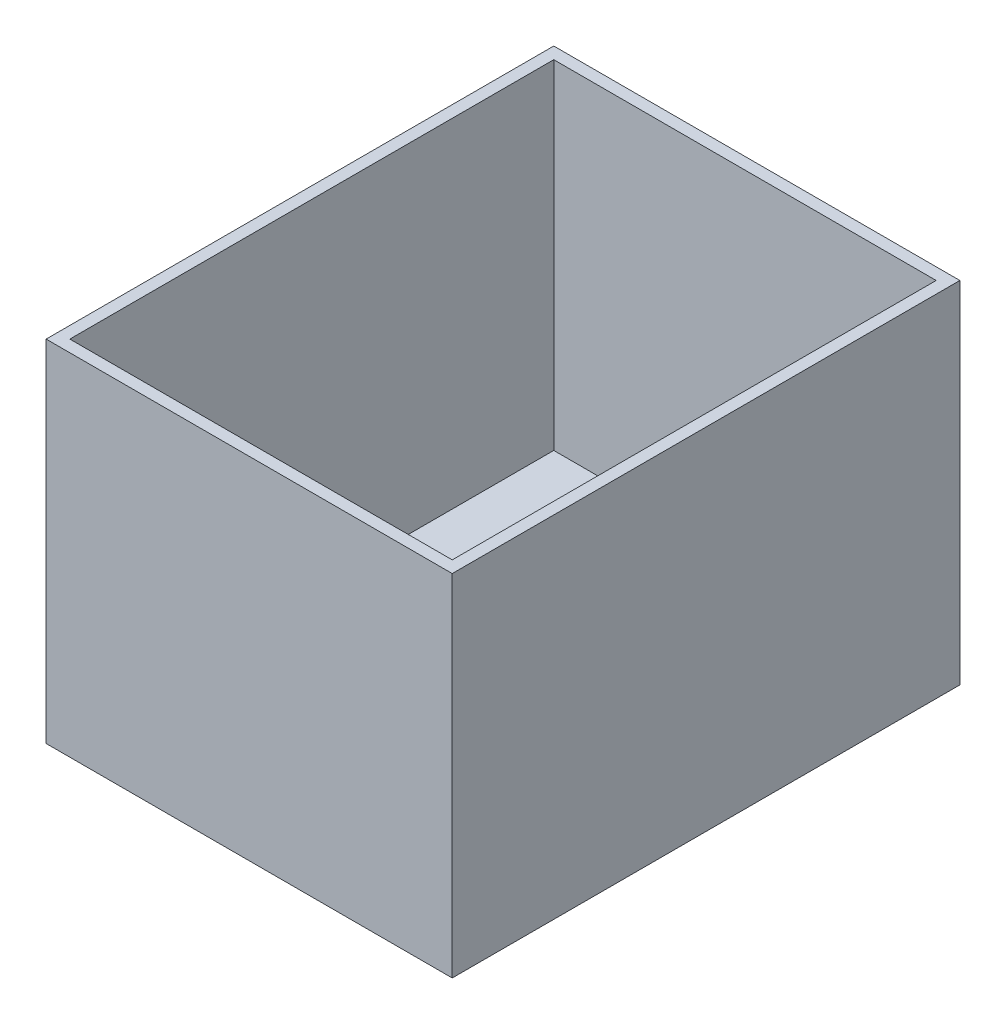
ISO-10303-21;
HEADER;
FILE_DESCRIPTION(('STEP AP214'),'2;1');
FILE_NAME('part.step','',(''),(''),'','','');
FILE_SCHEMA(('AUTOMOTIVE_DESIGN { 1 0 10303 214 1 1 1 1 }'));
ENDSEC;
DATA;
#1=APPLICATION_CONTEXT('core data for automotive mechanical design processes');
#2=APPLICATION_PROTOCOL_DEFINITION('international standard','automotive_design',2000,#1);
#3=PRODUCT_CONTEXT('',#1,'mechanical');
#4=PRODUCT('Part','Part','',(#3));
#5=PRODUCT_RELATED_PRODUCT_CATEGORY('part','',(#4));
#6=PRODUCT_DEFINITION_FORMATION('','',#4);
#7=PRODUCT_DEFINITION_CONTEXT('part definition',#1,'design');
#8=PRODUCT_DEFINITION('design','',#6,#7);
#9=PRODUCT_DEFINITION_SHAPE('','',#8);
#10=(LENGTH_UNIT() NAMED_UNIT(*) SI_UNIT(.MILLI.,.METRE.));
#11=(NAMED_UNIT(*) PLANE_ANGLE_UNIT() SI_UNIT($,.RADIAN.));
#12=(NAMED_UNIT(*) SI_UNIT($,.STERADIAN.) SOLID_ANGLE_UNIT());
#13=UNCERTAINTY_MEASURE_WITH_UNIT(LENGTH_MEASURE(1.E-05),#10,'distance_accuracy_value','');
#14=(GEOMETRIC_REPRESENTATION_CONTEXT(3) GLOBAL_UNCERTAINTY_ASSIGNED_CONTEXT((#13)) GLOBAL_UNIT_ASSIGNED_CONTEXT((#10,
#11,#12)) REPRESENTATION_CONTEXT('',''));
#15=CARTESIAN_POINT('',(0.,0.,0.));
#16=DIRECTION('',(0.,0.,1.));
#17=DIRECTION('',(1.,0.,0.));
#18=AXIS2_PLACEMENT_3D('',#15,#16,#17);
#19=CARTESIAN_POINT('',(0.,3.5,0.));
#20=DIRECTION('',(-1.,0.,0.));
#21=DIRECTION('',(0.,0.,1.));
#22=AXIS2_PLACEMENT_3D('',#19,#20,#21);
#23=PLANE('',#22);
#24=DIRECTION('',(0.,0.,-1.));
#25=VECTOR('',#24,1.);
#26=CARTESIAN_POINT('',(0.,0.,0.));
#27=LINE('',#26,#25);
#28=CARTESIAN_POINT('',(0.,0.,0.));
#29=VERTEX_POINT('',#28);
#30=CARTESIAN_POINT('',(0.,0.,-150.));
#31=VERTEX_POINT('',#30);
#32=EDGE_CURVE('E173',#29,#31,#27,.T.);
#33=ORIENTED_EDGE('',*,*,#32,.T.);
#34=DIRECTION('',(0.,-1.,0.));
#35=VECTOR('',#34,1.);
#36=CARTESIAN_POINT('',(0.,3.5,-150.));
#37=LINE('',#36,#35);
#38=CARTESIAN_POINT('',(0.,103.5,-150.));
#39=VERTEX_POINT('',#38);
#40=EDGE_CURVE('E11',#39,#31,#37,.T.);
#41=ORIENTED_EDGE('',*,*,#40,.F.);
#42=DIRECTION('',(0.,0.,-1.));
#43=VECTOR('',#42,1.);
#44=CARTESIAN_POINT('',(0.,103.5,0.));
#45=LINE('',#44,#43);
#46=CARTESIAN_POINT('',(0.,103.5,0.));
#47=VERTEX_POINT('',#46);
#48=EDGE_CURVE('E161',#47,#39,#45,.T.);
#49=ORIENTED_EDGE('',*,*,#48,.F.);
#50=DIRECTION('',(0.,-1.,0.));
#51=VECTOR('',#50,1.);
#52=CARTESIAN_POINT('',(0.,3.5,0.));
#53=LINE('',#52,#51);
#54=EDGE_CURVE('E186',#47,#29,#53,.T.);
#55=ORIENTED_EDGE('',*,*,#54,.T.);
#56=EDGE_LOOP('',(#33,#41,#49,#55));
#57=FACE_BOUND('',#56,.T.);
#58=ADVANCED_FACE('F45',(#57),#23,.F.);
#59=CARTESIAN_POINT('',(0.,3.5,-150.));
#60=DIRECTION('',(0.,0.,1.));
#61=DIRECTION('',(1.,0.,0.));
#62=AXIS2_PLACEMENT_3D('',#59,#60,#61);
#63=PLANE('',#62);
#64=DIRECTION('',(-1.,0.,0.));
#65=VECTOR('',#64,1.);
#66=CARTESIAN_POINT('',(0.,0.,-150.));
#67=LINE('',#66,#65);
#68=CARTESIAN_POINT('',(-120.,0.,-150.));
#69=VERTEX_POINT('',#68);
#70=EDGE_CURVE('E177',#31,#69,#67,.T.);
#71=ORIENTED_EDGE('',*,*,#70,.T.);
#72=DIRECTION('',(0.,-1.,0.));
#73=VECTOR('',#72,1.);
#74=CARTESIAN_POINT('',(-120.,3.5,-150.));
#75=LINE('',#74,#73);
#76=CARTESIAN_POINT('',(-120.,103.5,-150.));
#77=VERTEX_POINT('',#76);
#78=EDGE_CURVE('E53',#77,#69,#75,.T.);
#79=ORIENTED_EDGE('',*,*,#78,.F.);
#80=DIRECTION('',(-1.,0.,0.));
#81=VECTOR('',#80,1.);
#82=CARTESIAN_POINT('',(0.,103.5,-150.));
#83=LINE('',#82,#81);
#84=EDGE_CURVE('E165',#39,#77,#83,.T.);
#85=ORIENTED_EDGE('',*,*,#84,.F.);
#86=ORIENTED_EDGE('',*,*,#40,.T.);
#87=EDGE_LOOP('',(#71,#79,#85,#86));
#88=FACE_BOUND('',#87,.T.);
#89=ADVANCED_FACE('F211',(#88),#63,.F.);
#90=CARTESIAN_POINT('',(-120.,3.5,0.));
#91=DIRECTION('',(1.,0.,0.));
#92=DIRECTION('',(0.,0.,-1.));
#93=AXIS2_PLACEMENT_3D('',#90,#91,#92);
#94=PLANE('',#93);
#95=DIRECTION('',(0.,0.,1.));
#96=VECTOR('',#95,1.);
#97=CARTESIAN_POINT('',(-120.,0.,0.));
#98=LINE('',#97,#96);
#99=CARTESIAN_POINT('',(-120.,0.,0.));
#100=VERTEX_POINT('',#99);
#101=EDGE_CURVE('E180',#69,#100,#98,.T.);
#102=ORIENTED_EDGE('',*,*,#101,.T.);
#103=DIRECTION('',(0.,-1.,0.));
#104=VECTOR('',#103,1.);
#105=CARTESIAN_POINT('',(-120.,3.5,0.));
#106=LINE('',#105,#104);
#107=CARTESIAN_POINT('',(-120.,103.5,0.));
#108=VERTEX_POINT('',#107);
#109=EDGE_CURVE('E190',#108,#100,#106,.T.);
#110=ORIENTED_EDGE('',*,*,#109,.F.);
#111=DIRECTION('',(0.,0.,1.));
#112=VECTOR('',#111,1.);
#113=CARTESIAN_POINT('',(-120.,103.5,-150.));
#114=LINE('',#113,#112);
#115=EDGE_CURVE('E169',#77,#108,#114,.T.);
#116=ORIENTED_EDGE('',*,*,#115,.F.);
#117=ORIENTED_EDGE('',*,*,#78,.T.);
#118=EDGE_LOOP('',(#102,#110,#116,#117));
#119=FACE_BOUND('',#118,.T.);
#120=ADVANCED_FACE('F198',(#119),#94,.F.);
#121=CARTESIAN_POINT('',(0.,3.5,0.));
#122=DIRECTION('',(0.,0.,-1.));
#123=DIRECTION('',(-1.,0.,0.));
#124=AXIS2_PLACEMENT_3D('',#121,#122,#123);
#125=PLANE('',#124);
#126=DIRECTION('',(1.,0.,0.));
#127=VECTOR('',#126,1.);
#128=CARTESIAN_POINT('',(0.,0.,0.));
#129=LINE('',#128,#127);
#130=EDGE_CURVE('E183',#100,#29,#129,.T.);
#131=ORIENTED_EDGE('',*,*,#130,.T.);
#132=ORIENTED_EDGE('',*,*,#54,.F.);
#133=DIRECTION('',(1.,0.,0.));
#134=VECTOR('',#133,1.);
#135=CARTESIAN_POINT('',(-120.,103.5,0.));
#136=LINE('',#135,#134);
#137=EDGE_CURVE('E126',#108,#47,#136,.T.);
#138=ORIENTED_EDGE('',*,*,#137,.F.);
#139=ORIENTED_EDGE('',*,*,#109,.T.);
#140=EDGE_LOOP('',(#131,#132,#138,#139));
#141=FACE_BOUND('',#140,.T.);
#142=ADVANCED_FACE('F206',(#141),#125,.F.);
#143=CARTESIAN_POINT('',(0.,0.,0.));
#144=DIRECTION('',(0.,1.,0.));
#145=DIRECTION('',(0.,0.,1.));
#146=AXIS2_PLACEMENT_3D('',#143,#144,#145);
#147=PLANE('',#146);
#148=ORIENTED_EDGE('',*,*,#32,.F.);
#149=ORIENTED_EDGE('',*,*,#130,.F.);
#150=ORIENTED_EDGE('',*,*,#101,.F.);
#151=ORIENTED_EDGE('',*,*,#70,.F.);
#152=EDGE_LOOP('',(#148,#149,#150,#151));
#153=FACE_BOUND('',#152,.T.);
#154=ADVANCED_FACE('F204',(#153),#147,.F.);
#155=CARTESIAN_POINT('',(0.,103.5,0.));
#156=DIRECTION('',(0.,1.,0.));
#157=DIRECTION('',(0.,0.,1.));
#158=AXIS2_PLACEMENT_3D('',#155,#156,#157);
#159=PLANE('',#158);
#160=ORIENTED_EDGE('',*,*,#137,.T.);
#161=ORIENTED_EDGE('',*,*,#48,.T.);
#162=ORIENTED_EDGE('',*,*,#84,.T.);
#163=ORIENTED_EDGE('',*,*,#115,.T.);
#164=EDGE_LOOP('',(#160,#161,#162,#163));
#165=FACE_BOUND('',#164,.T.);
#166=DIRECTION('',(-1.,0.,0.));
#167=VECTOR('',#166,1.);
#168=CARTESIAN_POINT('',(-3.5,103.5,-146.5));
#169=LINE('',#168,#167);
#170=CARTESIAN_POINT('',(-3.5,103.5,-146.5));
#171=VERTEX_POINT('',#170);
#172=CARTESIAN_POINT('',(-116.5,103.5,-146.5));
#173=VERTEX_POINT('',#172);
#174=EDGE_CURVE('E119',#171,#173,#169,.T.);
#175=ORIENTED_EDGE('',*,*,#174,.F.);
#176=DIRECTION('',(0.,0.,-1.));
#177=VECTOR('',#176,1.);
#178=CARTESIAN_POINT('',(-3.5,103.5,-3.5));
#179=LINE('',#178,#177);
#180=CARTESIAN_POINT('',(-3.5,103.5,-3.5));
#181=VERTEX_POINT('',#180);
#182=EDGE_CURVE('E109',#181,#171,#179,.T.);
#183=ORIENTED_EDGE('',*,*,#182,.F.);
#184=DIRECTION('',(1.,0.,0.));
#185=VECTOR('',#184,1.);
#186=CARTESIAN_POINT('',(-3.5,103.5,-3.5));
#187=LINE('',#186,#185);
#188=CARTESIAN_POINT('',(-116.5,103.5,-3.49999999999999));
#189=VERTEX_POINT('',#188);
#190=EDGE_CURVE('E136',#189,#181,#187,.T.);
#191=ORIENTED_EDGE('',*,*,#190,.F.);
#192=DIRECTION('',(0.,0.,1.));
#193=VECTOR('',#192,1.);
#194=CARTESIAN_POINT('',(-116.5,103.5,-3.49999999999999));
#195=LINE('',#194,#193);
#196=EDGE_CURVE('E132',#173,#189,#195,.T.);
#197=ORIENTED_EDGE('',*,*,#196,.F.);
#198=EDGE_LOOP('',(#175,#183,#191,#197));
#199=FACE_BOUND('',#198,.T.);
#200=ADVANCED_FACE('F130',(#165,#199),#159,.T.);
#201=CARTESIAN_POINT('',(-3.5,103.5,-3.5));
#202=DIRECTION('',(-1.,0.,0.));
#203=DIRECTION('',(0.,0.,1.));
#204=AXIS2_PLACEMENT_3D('',#201,#202,#203);
#205=PLANE('',#204);
#206=DIRECTION('',(0.,0.,-1.));
#207=VECTOR('',#206,1.);
#208=CARTESIAN_POINT('',(-3.5,3.5,-3.5));
#209=LINE('',#208,#207);
#210=CARTESIAN_POINT('',(-3.5,3.5,-3.5));
#211=VERTEX_POINT('',#210);
#212=CARTESIAN_POINT('',(-3.5,3.5,-146.5));
#213=VERTEX_POINT('',#212);
#214=EDGE_CURVE('E60',#211,#213,#209,.T.);
#215=ORIENTED_EDGE('',*,*,#214,.F.);
#216=DIRECTION('',(0.,-1.,0.));
#217=VECTOR('',#216,1.);
#218=CARTESIAN_POINT('',(-3.5,103.5,-3.5));
#219=LINE('',#218,#217);
#220=EDGE_CURVE('E114',#181,#211,#219,.T.);
#221=ORIENTED_EDGE('',*,*,#220,.F.);
#222=ORIENTED_EDGE('',*,*,#182,.T.);
#223=DIRECTION('',(0.,-1.,0.));
#224=VECTOR('',#223,1.);
#225=CARTESIAN_POINT('',(-3.5,103.5,-146.5));
#226=LINE('',#225,#224);
#227=EDGE_CURVE('E112',#171,#213,#226,.T.);
#228=ORIENTED_EDGE('',*,*,#227,.T.);
#229=EDGE_LOOP('',(#215,#221,#222,#228));
#230=FACE_BOUND('',#229,.T.);
#231=ADVANCED_FACE('F111',(#230),#205,.T.);
#232=CARTESIAN_POINT('',(-3.5,103.5,-146.5));
#233=DIRECTION('',(0.,0.,1.));
#234=DIRECTION('',(1.,0.,0.));
#235=AXIS2_PLACEMENT_3D('',#232,#233,#234);
#236=PLANE('',#235);
#237=DIRECTION('',(-1.,0.,0.));
#238=VECTOR('',#237,1.);
#239=CARTESIAN_POINT('',(-3.5,3.5,-146.5));
#240=LINE('',#239,#238);
#241=CARTESIAN_POINT('',(-116.5,3.5,-146.5));
#242=VERTEX_POINT('',#241);
#243=EDGE_CURVE('E64',#213,#242,#240,.T.);
#244=ORIENTED_EDGE('',*,*,#243,.F.);
#245=ORIENTED_EDGE('',*,*,#227,.F.);
#246=ORIENTED_EDGE('',*,*,#174,.T.);
#247=DIRECTION('',(0.,-1.,0.));
#248=VECTOR('',#247,1.);
#249=CARTESIAN_POINT('',(-116.5,103.5,-146.5));
#250=LINE('',#249,#248);
#251=EDGE_CURVE('E127',#173,#242,#250,.T.);
#252=ORIENTED_EDGE('',*,*,#251,.T.);
#253=EDGE_LOOP('',(#244,#245,#246,#252));
#254=FACE_BOUND('',#253,.T.);
#255=ADVANCED_FACE('F123',(#254),#236,.T.);
#256=CARTESIAN_POINT('',(-116.5,103.5,-3.49999999999999));
#257=DIRECTION('',(1.,0.,0.));
#258=DIRECTION('',(0.,0.,-1.));
#259=AXIS2_PLACEMENT_3D('',#256,#257,#258);
#260=PLANE('',#259);
#261=DIRECTION('',(0.,0.,1.));
#262=VECTOR('',#261,1.);
#263=CARTESIAN_POINT('',(-116.5,3.5,-3.49999999999999));
#264=LINE('',#263,#262);
#265=CARTESIAN_POINT('',(-116.5,3.5,-3.49999999999999));
#266=VERTEX_POINT('',#265);
#267=EDGE_CURVE('E145',#242,#266,#264,.T.);
#268=ORIENTED_EDGE('',*,*,#267,.F.);
#269=ORIENTED_EDGE('',*,*,#251,.F.);
#270=ORIENTED_EDGE('',*,*,#196,.T.);
#271=DIRECTION('',(0.,-1.,0.));
#272=VECTOR('',#271,1.);
#273=CARTESIAN_POINT('',(-116.5,103.5,-3.49999999999999));
#274=LINE('',#273,#272);
#275=EDGE_CURVE('E152',#189,#266,#274,.T.);
#276=ORIENTED_EDGE('',*,*,#275,.T.);
#277=EDGE_LOOP('',(#268,#269,#270,#276));
#278=FACE_BOUND('',#277,.T.);
#279=ADVANCED_FACE('F233',(#278),#260,.T.);
#280=CARTESIAN_POINT('',(-3.5,103.5,-3.5));
#281=DIRECTION('',(0.,0.,-1.));
#282=DIRECTION('',(-1.,0.,0.));
#283=AXIS2_PLACEMENT_3D('',#280,#281,#282);
#284=PLANE('',#283);
#285=DIRECTION('',(1.,0.,0.));
#286=VECTOR('',#285,1.);
#287=CARTESIAN_POINT('',(-3.5,3.5,-3.5));
#288=LINE('',#287,#286);
#289=EDGE_CURVE('E120',#266,#211,#288,.T.);
#290=ORIENTED_EDGE('',*,*,#289,.F.);
#291=ORIENTED_EDGE('',*,*,#275,.F.);
#292=ORIENTED_EDGE('',*,*,#190,.T.);
#293=ORIENTED_EDGE('',*,*,#220,.T.);
#294=EDGE_LOOP('',(#290,#291,#292,#293));
#295=FACE_BOUND('',#294,.T.);
#296=ADVANCED_FACE('F226',(#295),#284,.T.);
#297=CARTESIAN_POINT('',(0.,3.5,0.));
#298=DIRECTION('',(0.,1.,0.));
#299=DIRECTION('',(0.,0.,1.));
#300=AXIS2_PLACEMENT_3D('',#297,#298,#299);
#301=PLANE('',#300);
#302=ORIENTED_EDGE('',*,*,#214,.T.);
#303=ORIENTED_EDGE('',*,*,#243,.T.);
#304=ORIENTED_EDGE('',*,*,#267,.T.);
#305=ORIENTED_EDGE('',*,*,#289,.T.);
#306=EDGE_LOOP('',(#302,#303,#304,#305));
#307=FACE_BOUND('',#306,.T.);
#308=ADVANCED_FACE('F223',(#307),#301,.T.);
#309=CLOSED_SHELL('',(#58,#89,#120,#142,#154,#200,#231,#255,#279,#296,#308));
#310=MANIFOLD_SOLID_BREP('B2',#309);
#311=ADVANCED_BREP_SHAPE_REPRESENTATION('',(#18,#310),#14);
#312=SHAPE_DEFINITION_REPRESENTATION(#9,#311);
ENDSEC;
END-ISO-10303-21;
